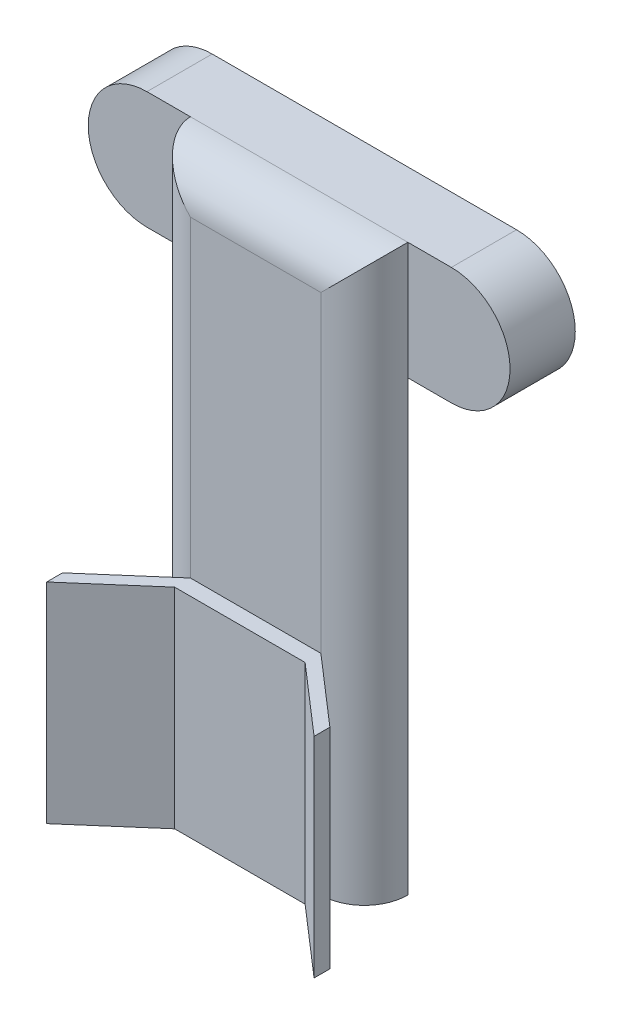
ISO-10303-21;
HEADER;
FILE_DESCRIPTION(('STEP AP214'),'2;1');
FILE_NAME('part.step','',(''),(''),'','','');
FILE_SCHEMA(('AUTOMOTIVE_DESIGN { 1 0 10303 214 1 1 1 1 }'));
ENDSEC;
DATA;
#1=APPLICATION_CONTEXT('core data for automotive mechanical design processes');
#2=APPLICATION_PROTOCOL_DEFINITION('international standard','automotive_design',2000,#1);
#3=PRODUCT_CONTEXT('',#1,'mechanical');
#4=PRODUCT('Part','Part','',(#3));
#5=PRODUCT_RELATED_PRODUCT_CATEGORY('part','',(#4));
#6=PRODUCT_DEFINITION_FORMATION('','',#4);
#7=PRODUCT_DEFINITION_CONTEXT('part definition',#1,'design');
#8=PRODUCT_DEFINITION('design','',#6,#7);
#9=PRODUCT_DEFINITION_SHAPE('','',#8);
#10=(LENGTH_UNIT() NAMED_UNIT(*) SI_UNIT(.MILLI.,.METRE.));
#11=(NAMED_UNIT(*) PLANE_ANGLE_UNIT() SI_UNIT($,.RADIAN.));
#12=(NAMED_UNIT(*) SI_UNIT($,.STERADIAN.) SOLID_ANGLE_UNIT());
#13=UNCERTAINTY_MEASURE_WITH_UNIT(LENGTH_MEASURE(1.E-05),#10,'distance_accuracy_value','');
#14=(GEOMETRIC_REPRESENTATION_CONTEXT(3) GLOBAL_UNCERTAINTY_ASSIGNED_CONTEXT((#13)) GLOBAL_UNIT_ASSIGNED_CONTEXT((#10,
#11,#12)) REPRESENTATION_CONTEXT('',''));
#15=CARTESIAN_POINT('',(0.,0.,0.));
#16=DIRECTION('',(0.,0.,1.));
#17=DIRECTION('',(1.,0.,0.));
#18=AXIS2_PLACEMENT_3D('',#15,#16,#17);
#19=CARTESIAN_POINT('',(15.,133.606993365739,15.));
#20=DIRECTION('',(0.,0.,1.));
#21=DIRECTION('',(1.,0.,0.));
#22=AXIS2_PLACEMENT_3D('',#19,#20,#21);
#23=PLANE('',#22);
#24=DIRECTION('',(0.,-1.,0.));
#25=VECTOR('',#24,1.);
#26=CARTESIAN_POINT('',(-10.,225.565015771818,15.));
#27=LINE('',#26,#25);
#28=CARTESIAN_POINT('',(-10.,225.565015771818,15.));
#29=VERTEX_POINT('',#28);
#30=CARTESIAN_POINT('',(-10.,198.565015771818,15.));
#31=VERTEX_POINT('',#30);
#32=EDGE_CURVE('E210',#29,#31,#27,.T.);
#33=ORIENTED_EDGE('',*,*,#32,.F.);
#34=DIRECTION('',(-1.,0.,0.));
#35=VECTOR('',#34,1.);
#36=CARTESIAN_POINT('',(15.,225.565015771818,15.));
#37=LINE('',#36,#35);
#38=CARTESIAN_POINT('',(-20.,225.565015771818,15.));
#39=VERTEX_POINT('',#38);
#40=EDGE_CURVE('E292',#29,#39,#37,.T.);
#41=ORIENTED_EDGE('',*,*,#40,.T.);
#42=CARTESIAN_POINT('',(-20.,212.065015771818,15.));
#43=DIRECTION('',(0.,0.,1.));
#44=DIRECTION('',(1.,0.,0.));
#45=AXIS2_PLACEMENT_3D('',#42,#43,#44);
#46=CIRCLE('',#45,13.5);
#47=CARTESIAN_POINT('',(-20.,198.565015771818,15.));
#48=VERTEX_POINT('',#47);
#49=EDGE_CURVE('E289',#39,#48,#46,.T.);
#50=ORIENTED_EDGE('',*,*,#49,.T.);
#51=DIRECTION('',(-1.,0.,0.));
#52=VECTOR('',#51,1.);
#53=CARTESIAN_POINT('',(15.,198.565015771818,15.));
#54=LINE('',#53,#52);
#55=EDGE_CURVE('E318',#31,#48,#54,.T.);
#56=ORIENTED_EDGE('',*,*,#55,.F.);
#57=EDGE_LOOP('',(#33,#41,#50,#56));
#58=FACE_BOUND('',#57,.T.);
#59=ADVANCED_FACE('F34',(#58),#23,.T.);
#60=CARTESIAN_POINT('',(15.,225.565015771818,15.));
#61=DIRECTION('',(0.,-1.,0.));
#62=DIRECTION('',(0.,0.,-1.));
#63=AXIS2_PLACEMENT_3D('',#60,#61,#62);
#64=PLANE('',#63);
#65=ORIENTED_EDGE('',*,*,#40,.F.);
#66=DIRECTION('',(-1.,0.,0.));
#67=VECTOR('',#66,1.);
#68=CARTESIAN_POINT('',(40.,225.565015771818,15.));
#69=LINE('',#68,#67);
#70=CARTESIAN_POINT('',(40.,225.565015771818,15.));
#71=VERTEX_POINT('',#70);
#72=EDGE_CURVE('E11',#29,#71,#69,.F.);
#73=ORIENTED_EDGE('',*,*,#72,.T.);
#74=CARTESIAN_POINT('',(50.,225.565015771818,15.));
#75=VERTEX_POINT('',#74);
#76=EDGE_CURVE('E294',#75,#71,#37,.T.);
#77=ORIENTED_EDGE('',*,*,#76,.F.);
#78=DIRECTION('',(0.,0.,-1.));
#79=VECTOR('',#78,1.);
#80=CARTESIAN_POINT('',(50.,225.565015771818,15.));
#81=LINE('',#80,#79);
#82=CARTESIAN_POINT('',(50.,225.565015771818,0.));
#83=VERTEX_POINT('',#82);
#84=EDGE_CURVE('E304',#75,#83,#81,.T.);
#85=ORIENTED_EDGE('',*,*,#84,.T.);
#86=DIRECTION('',(-1.,0.,0.));
#87=VECTOR('',#86,1.);
#88=CARTESIAN_POINT('',(15.,225.565015771818,0.));
#89=LINE('',#88,#87);
#90=CARTESIAN_POINT('',(-20.,225.565015771818,0.));
#91=VERTEX_POINT('',#90);
#92=EDGE_CURVE('E281',#83,#91,#89,.T.);
#93=ORIENTED_EDGE('',*,*,#92,.T.);
#94=DIRECTION('',(0.,0.,-1.));
#95=VECTOR('',#94,1.);
#96=CARTESIAN_POINT('',(-20.,225.565015771818,15.));
#97=LINE('',#96,#95);
#98=EDGE_CURVE('E297',#39,#91,#97,.T.);
#99=ORIENTED_EDGE('',*,*,#98,.F.);
#100=EDGE_LOOP('',(#65,#73,#77,#85,#93,#99));
#101=FACE_BOUND('',#100,.T.);
#102=ADVANCED_FACE('F342',(#101),#64,.F.);
#103=CARTESIAN_POINT('',(-20.,212.065015771818,15.));
#104=DIRECTION('',(0.,0.,-1.));
#105=DIRECTION('',(-1.,0.,0.));
#106=AXIS2_PLACEMENT_3D('',#103,#104,#105);
#107=CYLINDRICAL_SURFACE('',#106,13.5);
#108=CARTESIAN_POINT('',(-20.,212.065015771818,0.));
#109=DIRECTION('',(0.,0.,1.));
#110=DIRECTION('',(1.,0.,0.));
#111=AXIS2_PLACEMENT_3D('',#108,#109,#110);
#112=CIRCLE('',#111,13.5);
#113=CARTESIAN_POINT('',(-20.,198.565015771818,0.));
#114=VERTEX_POINT('',#113);
#115=EDGE_CURVE('E283',#91,#114,#112,.T.);
#116=ORIENTED_EDGE('',*,*,#115,.T.);
#117=DIRECTION('',(0.,0.,-1.));
#118=VECTOR('',#117,1.);
#119=CARTESIAN_POINT('',(-20.,198.565015771818,15.));
#120=LINE('',#119,#118);
#121=EDGE_CURVE('E300',#48,#114,#120,.T.);
#122=ORIENTED_EDGE('',*,*,#121,.F.);
#123=ORIENTED_EDGE('',*,*,#49,.F.);
#124=ORIENTED_EDGE('',*,*,#98,.T.);
#125=EDGE_LOOP('',(#116,#122,#123,#124));
#126=FACE_BOUND('',#125,.T.);
#127=ADVANCED_FACE('F329',(#126),#107,.T.);
#128=CARTESIAN_POINT('',(15.,198.565015771818,15.));
#129=DIRECTION('',(0.,-1.,0.));
#130=DIRECTION('',(0.,0.,-1.));
#131=AXIS2_PLACEMENT_3D('',#128,#129,#130);
#132=PLANE('',#131);
#133=DIRECTION('',(-1.,0.,0.));
#134=VECTOR('',#133,1.);
#135=CARTESIAN_POINT('',(15.,198.565015771818,0.));
#136=LINE('',#135,#134);
#137=CARTESIAN_POINT('',(50.,198.565015771818,0.));
#138=VERTEX_POINT('',#137);
#139=EDGE_CURVE('E310',#138,#114,#136,.T.);
#140=ORIENTED_EDGE('',*,*,#139,.F.);
#141=DIRECTION('',(0.,0.,-1.));
#142=VECTOR('',#141,1.);
#143=CARTESIAN_POINT('',(50.,198.565015771818,15.));
#144=LINE('',#143,#142);
#145=CARTESIAN_POINT('',(50.,198.565015771818,15.));
#146=VERTEX_POINT('',#145);
#147=EDGE_CURVE('E302',#146,#138,#144,.T.);
#148=ORIENTED_EDGE('',*,*,#147,.F.);
#149=CARTESIAN_POINT('',(40.,198.565015771818,15.));
#150=VERTEX_POINT('',#149);
#151=EDGE_CURVE('E315',#146,#150,#54,.T.);
#152=ORIENTED_EDGE('',*,*,#151,.T.);
#153=EDGE_CURVE('E317',#150,#31,#54,.T.);
#154=ORIENTED_EDGE('',*,*,#153,.T.);
#155=ORIENTED_EDGE('',*,*,#55,.T.);
#156=ORIENTED_EDGE('',*,*,#121,.T.);
#157=EDGE_LOOP('',(#140,#148,#152,#154,#155,#156));
#158=FACE_BOUND('',#157,.T.);
#159=ADVANCED_FACE('F331',(#158),#132,.T.);
#160=CARTESIAN_POINT('',(50.,212.065015771818,15.));
#161=DIRECTION('',(0.,0.,-1.));
#162=DIRECTION('',(-1.,0.,0.));
#163=AXIS2_PLACEMENT_3D('',#160,#161,#162);
#164=CYLINDRICAL_SURFACE('',#163,13.5);
#165=CARTESIAN_POINT('',(50.,212.065015771818,0.));
#166=DIRECTION('',(0.,0.,1.));
#167=DIRECTION('',(1.,0.,0.));
#168=AXIS2_PLACEMENT_3D('',#165,#166,#167);
#169=CIRCLE('',#168,13.5);
#170=EDGE_CURVE('E308',#138,#83,#169,.T.);
#171=ORIENTED_EDGE('',*,*,#170,.T.);
#172=ORIENTED_EDGE('',*,*,#84,.F.);
#173=CARTESIAN_POINT('',(50.,212.065015771818,15.));
#174=DIRECTION('',(0.,0.,1.));
#175=DIRECTION('',(1.,0.,0.));
#176=AXIS2_PLACEMENT_3D('',#173,#174,#175);
#177=CIRCLE('',#176,13.5);
#178=EDGE_CURVE('E307',#146,#75,#177,.T.);
#179=ORIENTED_EDGE('',*,*,#178,.F.);
#180=ORIENTED_EDGE('',*,*,#147,.T.);
#181=EDGE_LOOP('',(#171,#172,#179,#180));
#182=FACE_BOUND('',#181,.T.);
#183=ADVANCED_FACE('F339',(#182),#164,.T.);
#184=DIRECTION('',(0.,1.,0.));
#185=VECTOR('',#184,1.);
#186=CARTESIAN_POINT('',(40.,225.565015771818,15.));
#187=LINE('',#186,#185);
#188=EDGE_CURVE('E218',#150,#71,#187,.T.);
#189=ORIENTED_EDGE('',*,*,#188,.F.);
#190=ORIENTED_EDGE('',*,*,#151,.F.);
#191=ORIENTED_EDGE('',*,*,#178,.T.);
#192=ORIENTED_EDGE('',*,*,#76,.T.);
#193=EDGE_LOOP('',(#189,#190,#191,#192));
#194=FACE_BOUND('',#193,.T.);
#195=ADVANCED_FACE('F344',(#194),#23,.T.);
#196=CARTESIAN_POINT('',(15.,133.606993365739,0.));
#197=DIRECTION('',(0.,0.,1.));
#198=DIRECTION('',(1.,0.,0.));
#199=AXIS2_PLACEMENT_3D('',#196,#197,#198);
#200=PLANE('',#199);
#201=ORIENTED_EDGE('',*,*,#92,.F.);
#202=ORIENTED_EDGE('',*,*,#170,.F.);
#203=ORIENTED_EDGE('',*,*,#139,.T.);
#204=ORIENTED_EDGE('',*,*,#115,.F.);
#205=EDGE_LOOP('',(#201,#202,#203,#204));
#206=FACE_BOUND('',#205,.T.);
#207=ADVANCED_FACE('F336',(#206),#200,.F.);
#208=CARTESIAN_POINT('',(-10.,95.5650157718177,25.));
#209=DIRECTION('',(0.,1.,0.));
#210=DIRECTION('',(0.,0.,1.));
#211=AXIS2_PLACEMENT_3D('',#208,#209,#210);
#212=PLANE('',#211);
#213=DIRECTION('',(0.754898050561559,0.,-0.655842155749658));
#214=VECTOR('',#213,1.);
#215=CARTESIAN_POINT('',(31.9181543078593,95.5650157718177,-2.7299313639036));
#216=LINE('',#215,#214);
#217=CARTESIAN_POINT('',(-15.7417727365288,95.5650157718177,38.6761754241732));
#218=VERTEX_POINT('',#217);
#219=CARTESIAN_POINT('',(0.,95.5650157718177,25.));
#220=VERTEX_POINT('',#219);
#221=EDGE_CURVE('E159',#218,#220,#216,.T.);
#222=ORIENTED_EDGE('',*,*,#221,.T.);
#223=CARTESIAN_POINT('',(0.,95.5650157718177,15.));
#224=DIRECTION('',(0.,1.,0.));
#225=DIRECTION('',(0.,0.,1.));
#226=AXIS2_PLACEMENT_3D('',#223,#224,#225);
#227=CIRCLE('',#226,10.);
#228=CARTESIAN_POINT('',(-10.,95.5650157718177,15.));
#229=VERTEX_POINT('',#228);
#230=EDGE_CURVE('E224',#220,#229,#227,.F.);
#231=ORIENTED_EDGE('',*,*,#230,.T.);
#232=DIRECTION('',(1.,0.,0.));
#233=VECTOR('',#232,1.);
#234=CARTESIAN_POINT('',(-10.,95.5650157718177,15.));
#235=LINE('',#234,#233);
#236=CARTESIAN_POINT('',(40.,95.5650157718177,15.));
#237=VERTEX_POINT('',#236);
#238=EDGE_CURVE('E212',#229,#237,#235,.T.);
#239=ORIENTED_EDGE('',*,*,#238,.T.);
#240=CARTESIAN_POINT('',(30.,95.5650157718177,15.));
#241=DIRECTION('',(0.,1.,0.));
#242=DIRECTION('',(0.,0.,1.));
#243=AXIS2_PLACEMENT_3D('',#240,#241,#242);
#244=CIRCLE('',#243,10.);
#245=CARTESIAN_POINT('',(30.,95.5650157718177,25.));
#246=VERTEX_POINT('',#245);
#247=EDGE_CURVE('E43',#237,#246,#244,.F.);
#248=ORIENTED_EDGE('',*,*,#247,.T.);
#249=DIRECTION('',(-0.754898050561559,0.,-0.655842155749658));
#250=VECTOR('',#249,1.);
#251=CARTESIAN_POINT('',(-1.91815430785926,95.5650157718177,-2.7299313639036));
#252=LINE('',#251,#250);
#253=CARTESIAN_POINT('',(45.7417727365288,95.5650157718177,38.6761754241732));
#254=VERTEX_POINT('',#253);
#255=EDGE_CURVE('E203',#254,#246,#252,.T.);
#256=ORIENTED_EDGE('',*,*,#255,.F.);
#257=DIRECTION('',(0.,0.,1.));
#258=VECTOR('',#257,1.);
#259=CARTESIAN_POINT('',(45.7417727365288,95.5650157718177,-22.2033390949212));
#260=LINE('',#259,#258);
#261=CARTESIAN_POINT('',(45.7417727365288,95.5650157718177,42.3080092611636));
#262=VERTEX_POINT('',#261);
#263=EDGE_CURVE('E156',#254,#262,#260,.T.);
#264=ORIENTED_EDGE('',*,*,#263,.T.);
#265=DIRECTION('',(-0.754898050561559,0.,-0.655842155749658));
#266=VECTOR('',#265,1.);
#267=CARTESIAN_POINT('',(-3.71625332189674,95.5650157718177,-0.660254340989451));
#268=LINE('',#267,#266);
#269=CARTESIAN_POINT('',(30.,95.5650157718177,28.6318338369905));
#270=VERTEX_POINT('',#269);
#271=EDGE_CURVE('E267',#262,#270,#268,.T.);
#272=ORIENTED_EDGE('',*,*,#271,.T.);
#273=DIRECTION('',(-1.,0.,0.));
#274=VECTOR('',#273,1.);
#275=CARTESIAN_POINT('',(15.,95.5650157718177,28.6318338369905));
#276=LINE('',#275,#274);
#277=CARTESIAN_POINT('',(0.,95.5650157718177,28.6318338369905));
#278=VERTEX_POINT('',#277);
#279=EDGE_CURVE('E263',#270,#278,#276,.T.);
#280=ORIENTED_EDGE('',*,*,#279,.T.);
#281=DIRECTION('',(0.754898050561559,0.,-0.655842155749658));
#282=VECTOR('',#281,1.);
#283=CARTESIAN_POINT('',(33.7162533218968,95.5650157718177,-0.660254340989441));
#284=LINE('',#283,#282);
#285=CARTESIAN_POINT('',(-15.7417727365288,95.5650157718177,42.3080092611636));
#286=VERTEX_POINT('',#285);
#287=EDGE_CURVE('E271',#286,#278,#284,.T.);
#288=ORIENTED_EDGE('',*,*,#287,.F.);
#289=DIRECTION('',(0.,0.,1.));
#290=VECTOR('',#289,1.);
#291=CARTESIAN_POINT('',(-15.7417727365288,95.5650157718177,-22.2033390949212));
#292=LINE('',#291,#290);
#293=EDGE_CURVE('E471',#218,#286,#292,.T.);
#294=ORIENTED_EDGE('',*,*,#293,.F.);
#295=EDGE_LOOP('',(#222,#231,#239,#248,#256,#264,#272,#280,#288,#294));
#296=FACE_BOUND('',#295,.T.);
#297=ADVANCED_FACE('F274',(#296),#212,.F.);
#298=CARTESIAN_POINT('',(-10.,95.5650157718177,25.));
#299=DIRECTION('',(0.,0.,1.));
#300=DIRECTION('',(1.,0.,0.));
#301=AXIS2_PLACEMENT_3D('',#298,#299,#300);
#302=PLANE('',#301);
#303=DIRECTION('',(-1.,0.,0.));
#304=VECTOR('',#303,1.);
#305=CARTESIAN_POINT('',(0.,143.698809563473,25.));
#306=LINE('',#305,#304);
#307=CARTESIAN_POINT('',(30.,143.698809563473,25.));
#308=VERTEX_POINT('',#307);
#309=CARTESIAN_POINT('',(0.,143.698809563473,25.));
#310=VERTEX_POINT('',#309);
#311=EDGE_CURVE('E202',#308,#310,#306,.T.);
#312=ORIENTED_EDGE('',*,*,#311,.F.);
#313=DIRECTION('',(0.,1.,0.));
#314=VECTOR('',#313,1.);
#315=CARTESIAN_POINT('',(30.,225.565015771818,25.));
#316=LINE('',#315,#314);
#317=CARTESIAN_POINT('',(30.,215.565015771818,25.));
#318=VERTEX_POINT('',#317);
#319=EDGE_CURVE('E56',#308,#318,#316,.T.);
#320=ORIENTED_EDGE('',*,*,#319,.T.);
#321=DIRECTION('',(-1.,0.,0.));
#322=VECTOR('',#321,1.);
#323=CARTESIAN_POINT('',(-10.,215.565015771818,25.));
#324=LINE('',#323,#322);
#325=CARTESIAN_POINT('',(0.,215.565015771818,25.));
#326=VERTEX_POINT('',#325);
#327=EDGE_CURVE('E51',#318,#326,#324,.T.);
#328=ORIENTED_EDGE('',*,*,#327,.T.);
#329=DIRECTION('',(0.,-1.,0.));
#330=VECTOR('',#329,1.);
#331=CARTESIAN_POINT('',(0.,95.5650157718177,25.));
#332=LINE('',#331,#330);
#333=EDGE_CURVE('E221',#326,#310,#332,.T.);
#334=ORIENTED_EDGE('',*,*,#333,.T.);
#335=EDGE_LOOP('',(#312,#320,#328,#334));
#336=FACE_BOUND('',#335,.T.);
#337=ADVANCED_FACE('F242',(#336),#302,.T.);
#338=CARTESIAN_POINT('',(-10.,95.5650157718177,15.));
#339=DIRECTION('',(0.,0.,1.));
#340=DIRECTION('',(1.,0.,0.));
#341=AXIS2_PLACEMENT_3D('',#338,#339,#340);
#342=PLANE('',#341);
#343=ORIENTED_EDGE('',*,*,#153,.F.);
#344=EDGE_CURVE('E278',#237,#150,#187,.T.);
#345=ORIENTED_EDGE('',*,*,#344,.F.);
#346=ORIENTED_EDGE('',*,*,#238,.F.);
#347=EDGE_CURVE('E206',#31,#229,#27,.T.);
#348=ORIENTED_EDGE('',*,*,#347,.F.);
#349=EDGE_LOOP('',(#343,#345,#346,#348));
#350=FACE_BOUND('',#349,.T.);
#351=ADVANCED_FACE('F370',(#350),#342,.F.);
#352=CARTESIAN_POINT('',(0.,95.5650157718177,15.));
#353=DIRECTION('',(0.,1.,0.));
#354=DIRECTION('',(-1.,0.,0.));
#355=AXIS2_PLACEMENT_3D('',#352,#353,#354);
#356=CYLINDRICAL_SURFACE('',#355,10.);
#357=ORIENTED_EDGE('',*,*,#230,.F.);
#358=DIRECTION('',(0.,-1.,0.));
#359=VECTOR('',#358,1.);
#360=CARTESIAN_POINT('',(0.,143.698809563473,25.));
#361=LINE('',#360,#359);
#362=EDGE_CURVE('E199',#310,#220,#361,.T.);
#363=ORIENTED_EDGE('',*,*,#362,.F.);
#364=ORIENTED_EDGE('',*,*,#333,.F.);
#365=CARTESIAN_POINT('',(0.,215.565015771818,15.));
#366=DIRECTION('',(0.707106781186547,0.707106781186548,0.));
#367=DIRECTION('',(0.707106781186548,-0.707106781186547,0.));
#368=AXIS2_PLACEMENT_3D('',#365,#366,#367);
#369=ELLIPSE('',#368,14.142135623731,10.);
#370=EDGE_CURVE('E211',#29,#326,#369,.T.);
#371=ORIENTED_EDGE('',*,*,#370,.F.);
#372=ORIENTED_EDGE('',*,*,#32,.T.);
#373=ORIENTED_EDGE('',*,*,#347,.T.);
#374=EDGE_LOOP('',(#357,#363,#364,#371,#372,#373));
#375=FACE_BOUND('',#374,.T.);
#376=ADVANCED_FACE('F36',(#375),#356,.T.);
#377=CARTESIAN_POINT('',(-10.,215.565015771818,15.));
#378=DIRECTION('',(1.,0.,0.));
#379=DIRECTION('',(0.,0.,-1.));
#380=AXIS2_PLACEMENT_3D('',#377,#378,#379);
#381=CYLINDRICAL_SURFACE('',#380,10.);
#382=ORIENTED_EDGE('',*,*,#370,.T.);
#383=ORIENTED_EDGE('',*,*,#327,.F.);
#384=CARTESIAN_POINT('',(30.,215.565015771818,15.));
#385=DIRECTION('',(0.707106781186547,-0.707106781186547,0.));
#386=DIRECTION('',(0.707106781186547,0.707106781186548,0.));
#387=AXIS2_PLACEMENT_3D('',#384,#385,#386);
#388=ELLIPSE('',#387,14.1421356237309,10.);
#389=EDGE_CURVE('E205',#71,#318,#388,.T.);
#390=ORIENTED_EDGE('',*,*,#389,.F.);
#391=ORIENTED_EDGE('',*,*,#72,.F.);
#392=EDGE_LOOP('',(#382,#383,#390,#391));
#393=FACE_BOUND('',#392,.T.);
#394=ADVANCED_FACE('F239',(#393),#381,.T.);
#395=CARTESIAN_POINT('',(30.,95.5650157718177,15.));
#396=DIRECTION('',(0.,-1.,0.));
#397=DIRECTION('',(1.,0.,0.));
#398=AXIS2_PLACEMENT_3D('',#395,#396,#397);
#399=CYLINDRICAL_SURFACE('',#398,10.);
#400=ORIENTED_EDGE('',*,*,#344,.T.);
#401=ORIENTED_EDGE('',*,*,#188,.T.);
#402=ORIENTED_EDGE('',*,*,#389,.T.);
#403=ORIENTED_EDGE('',*,*,#319,.F.);
#404=EDGE_CURVE('E167',#246,#308,#316,.T.);
#405=ORIENTED_EDGE('',*,*,#404,.F.);
#406=ORIENTED_EDGE('',*,*,#247,.F.);
#407=EDGE_LOOP('',(#400,#401,#402,#403,#405,#406));
#408=FACE_BOUND('',#407,.T.);
#409=ADVANCED_FACE('F236',(#408),#399,.T.);
#410=CARTESIAN_POINT('',(15.,143.698809563473,-22.2033390949212));
#411=DIRECTION('',(0.,-1.,0.));
#412=DIRECTION('',(0.,0.,-1.));
#413=AXIS2_PLACEMENT_3D('',#410,#411,#412);
#414=PLANE('',#413);
#415=ORIENTED_EDGE('',*,*,#311,.T.);
#416=DIRECTION('',(-0.754898050561559,0.,0.655842155749658));
#417=VECTOR('',#416,1.);
#418=CARTESIAN_POINT('',(31.9181543078593,143.698809563473,-2.7299313639036));
#419=LINE('',#418,#417);
#420=CARTESIAN_POINT('',(-15.7417727365288,143.698809563473,38.6761754241732));
#421=VERTEX_POINT('',#420);
#422=EDGE_CURVE('E187',#310,#421,#419,.T.);
#423=ORIENTED_EDGE('',*,*,#422,.T.);
#424=DIRECTION('',(0.,0.,-1.));
#425=VECTOR('',#424,1.);
#426=CARTESIAN_POINT('',(-15.7417727365288,143.698809563473,-22.2033390949212));
#427=LINE('',#426,#425);
#428=CARTESIAN_POINT('',(-15.7417727365288,143.698809563473,42.3080092611636));
#429=VERTEX_POINT('',#428);
#430=EDGE_CURVE('E184',#429,#421,#427,.T.);
#431=ORIENTED_EDGE('',*,*,#430,.F.);
#432=DIRECTION('',(-0.754898050561559,0.,0.655842155749658));
#433=VECTOR('',#432,1.);
#434=CARTESIAN_POINT('',(33.7162533218968,143.698809563473,-0.660254340989441));
#435=LINE('',#434,#433);
#436=CARTESIAN_POINT('',(0.,143.698809563473,28.6318338369905));
#437=VERTEX_POINT('',#436);
#438=EDGE_CURVE('E181',#437,#429,#435,.T.);
#439=ORIENTED_EDGE('',*,*,#438,.F.);
#440=DIRECTION('',(1.,0.,0.));
#441=VECTOR('',#440,1.);
#442=CARTESIAN_POINT('',(15.,143.698809563473,28.6318338369905));
#443=LINE('',#442,#441);
#444=CARTESIAN_POINT('',(30.,143.698809563473,28.6318338369905));
#445=VERTEX_POINT('',#444);
#446=EDGE_CURVE('E176',#437,#445,#443,.T.);
#447=ORIENTED_EDGE('',*,*,#446,.T.);
#448=DIRECTION('',(0.754898050561559,0.,0.655842155749658));
#449=VECTOR('',#448,1.);
#450=CARTESIAN_POINT('',(-3.71625332189674,143.698809563473,-0.660254340989451));
#451=LINE('',#450,#449);
#452=CARTESIAN_POINT('',(45.7417727365288,143.698809563473,42.3080092611636));
#453=VERTEX_POINT('',#452);
#454=EDGE_CURVE('E174',#445,#453,#451,.T.);
#455=ORIENTED_EDGE('',*,*,#454,.T.);
#456=DIRECTION('',(0.,0.,-1.));
#457=VECTOR('',#456,1.);
#458=CARTESIAN_POINT('',(45.7417727365288,143.698809563473,-22.2033390949212));
#459=LINE('',#458,#457);
#460=CARTESIAN_POINT('',(45.7417727365288,143.698809563473,38.6761754241732));
#461=VERTEX_POINT('',#460);
#462=EDGE_CURVE('E154',#453,#461,#459,.T.);
#463=ORIENTED_EDGE('',*,*,#462,.T.);
#464=DIRECTION('',(0.754898050561559,0.,0.655842155749658));
#465=VECTOR('',#464,1.);
#466=CARTESIAN_POINT('',(-1.91815430785926,143.698809563473,-2.7299313639036));
#467=LINE('',#466,#465);
#468=EDGE_CURVE('E164',#308,#461,#467,.T.);
#469=ORIENTED_EDGE('',*,*,#468,.F.);
#470=EDGE_LOOP('',(#415,#423,#431,#439,#447,#455,#463,#469));
#471=FACE_BOUND('',#470,.T.);
#472=ADVANCED_FACE('F171',(#471),#414,.F.);
#473=CARTESIAN_POINT('',(31.9181543078593,29.0765077670453,-2.7299313639036));
#474=DIRECTION('',(-0.655842155749658,0.,-0.754898050561559));
#475=DIRECTION('',(-0.754898050561559,0.,0.655842155749658));
#476=AXIS2_PLACEMENT_3D('',#473,#474,#475);
#477=PLANE('',#476);
#478=ORIENTED_EDGE('',*,*,#221,.F.);
#479=DIRECTION('',(0.,1.,0.));
#480=VECTOR('',#479,1.);
#481=CARTESIAN_POINT('',(-15.7417727365288,29.0765077670453,38.6761754241732));
#482=LINE('',#481,#480);
#483=EDGE_CURVE('E190',#218,#421,#482,.T.);
#484=ORIENTED_EDGE('',*,*,#483,.T.);
#485=ORIENTED_EDGE('',*,*,#422,.F.);
#486=ORIENTED_EDGE('',*,*,#362,.T.);
#487=EDGE_LOOP('',(#478,#484,#485,#486));
#488=FACE_BOUND('',#487,.T.);
#489=ADVANCED_FACE('F247',(#488),#477,.T.);
#490=CARTESIAN_POINT('',(-15.7417727365288,29.0765077670453,-22.2033390949212));
#491=DIRECTION('',(1.,0.,0.));
#492=DIRECTION('',(0.,0.,-1.));
#493=AXIS2_PLACEMENT_3D('',#490,#491,#492);
#494=PLANE('',#493);
#495=ORIENTED_EDGE('',*,*,#483,.F.);
#496=ORIENTED_EDGE('',*,*,#293,.T.);
#497=DIRECTION('',(0.,1.,0.));
#498=VECTOR('',#497,1.);
#499=CARTESIAN_POINT('',(-15.7417727365288,29.0765077670453,42.3080092611636));
#500=LINE('',#499,#498);
#501=EDGE_CURVE('E192',#286,#429,#500,.T.);
#502=ORIENTED_EDGE('',*,*,#501,.T.);
#503=ORIENTED_EDGE('',*,*,#430,.T.);
#504=EDGE_LOOP('',(#495,#496,#502,#503));
#505=FACE_BOUND('',#504,.T.);
#506=ADVANCED_FACE('F252',(#505),#494,.F.);
#507=CARTESIAN_POINT('',(33.7162533218968,29.0765077670453,-0.660254340989441));
#508=DIRECTION('',(-0.655842155749658,0.,-0.754898050561559));
#509=DIRECTION('',(-0.754898050561559,0.,0.655842155749658));
#510=AXIS2_PLACEMENT_3D('',#507,#508,#509);
#511=PLANE('',#510);
#512=ORIENTED_EDGE('',*,*,#501,.F.);
#513=ORIENTED_EDGE('',*,*,#287,.T.);
#514=DIRECTION('',(0.,1.,0.));
#515=VECTOR('',#514,1.);
#516=CARTESIAN_POINT('',(0.,29.0765077670453,28.6318338369905));
#517=LINE('',#516,#515);
#518=EDGE_CURVE('E194',#278,#437,#517,.T.);
#519=ORIENTED_EDGE('',*,*,#518,.T.);
#520=ORIENTED_EDGE('',*,*,#438,.T.);
#521=EDGE_LOOP('',(#512,#513,#519,#520));
#522=FACE_BOUND('',#521,.T.);
#523=ADVANCED_FACE('F428',(#522),#511,.F.);
#524=CARTESIAN_POINT('',(15.,29.0765077670453,28.6318338369905));
#525=DIRECTION('',(0.,0.,1.));
#526=DIRECTION('',(1.,0.,0.));
#527=AXIS2_PLACEMENT_3D('',#524,#525,#526);
#528=PLANE('',#527);
#529=ORIENTED_EDGE('',*,*,#279,.F.);
#530=DIRECTION('',(0.,1.,0.));
#531=VECTOR('',#530,1.);
#532=CARTESIAN_POINT('',(30.,29.0765077670453,28.6318338369905));
#533=LINE('',#532,#531);
#534=EDGE_CURVE('E196',#270,#445,#533,.T.);
#535=ORIENTED_EDGE('',*,*,#534,.T.);
#536=ORIENTED_EDGE('',*,*,#446,.F.);
#537=ORIENTED_EDGE('',*,*,#518,.F.);
#538=EDGE_LOOP('',(#529,#535,#536,#537));
#539=FACE_BOUND('',#538,.T.);
#540=ADVANCED_FACE('F260',(#539),#528,.T.);
#541=CARTESIAN_POINT('',(-3.71625332189674,29.0765077670453,-0.660254340989451));
#542=DIRECTION('',(-0.655842155749658,0.,0.754898050561559));
#543=DIRECTION('',(0.754898050561559,0.,0.655842155749658));
#544=AXIS2_PLACEMENT_3D('',#541,#542,#543);
#545=PLANE('',#544);
#546=ORIENTED_EDGE('',*,*,#271,.F.);
#547=DIRECTION('',(0.,1.,0.));
#548=VECTOR('',#547,1.);
#549=CARTESIAN_POINT('',(45.7417727365288,29.0765077670453,42.3080092611636));
#550=LINE('',#549,#548);
#551=EDGE_CURVE('E160',#262,#453,#550,.T.);
#552=ORIENTED_EDGE('',*,*,#551,.T.);
#553=ORIENTED_EDGE('',*,*,#454,.F.);
#554=ORIENTED_EDGE('',*,*,#534,.F.);
#555=EDGE_LOOP('',(#546,#552,#553,#554));
#556=FACE_BOUND('',#555,.T.);
#557=ADVANCED_FACE('F266',(#556),#545,.T.);
#558=CARTESIAN_POINT('',(45.7417727365288,29.0765077670453,-22.2033390949212));
#559=DIRECTION('',(1.,0.,0.));
#560=DIRECTION('',(0.,0.,-1.));
#561=AXIS2_PLACEMENT_3D('',#558,#559,#560);
#562=PLANE('',#561);
#563=ORIENTED_EDGE('',*,*,#263,.F.);
#564=DIRECTION('',(0.,1.,0.));
#565=VECTOR('',#564,1.);
#566=CARTESIAN_POINT('',(45.7417727365288,29.0765077670453,38.6761754241732));
#567=LINE('',#566,#565);
#568=EDGE_CURVE('E149',#254,#461,#567,.T.);
#569=ORIENTED_EDGE('',*,*,#568,.T.);
#570=ORIENTED_EDGE('',*,*,#462,.F.);
#571=ORIENTED_EDGE('',*,*,#551,.F.);
#572=EDGE_LOOP('',(#563,#569,#570,#571));
#573=FACE_BOUND('',#572,.T.);
#574=ADVANCED_FACE('F151',(#573),#562,.T.);
#575=CARTESIAN_POINT('',(-1.91815430785926,29.0765077670453,-2.7299313639036));
#576=DIRECTION('',(-0.655842155749658,0.,0.754898050561559));
#577=DIRECTION('',(0.754898050561559,0.,0.655842155749658));
#578=AXIS2_PLACEMENT_3D('',#575,#576,#577);
#579=PLANE('',#578);
#580=ORIENTED_EDGE('',*,*,#568,.F.);
#581=ORIENTED_EDGE('',*,*,#255,.T.);
#582=ORIENTED_EDGE('',*,*,#404,.T.);
#583=ORIENTED_EDGE('',*,*,#468,.T.);
#584=EDGE_LOOP('',(#580,#581,#582,#583));
#585=FACE_BOUND('',#584,.T.);
#586=ADVANCED_FACE('F165',(#585),#579,.F.);
#587=CLOSED_SHELL('',(#59,#102,#127,#159,#183,#195,#207,#297,#337,#351,#376,#394,#409,#472,#489,
#506,#523,#540,#557,#574,#586));
#588=MANIFOLD_SOLID_BREP('B2',#587);
#589=ADVANCED_BREP_SHAPE_REPRESENTATION('',(#18,#588),#14);
#590=SHAPE_DEFINITION_REPRESENTATION(#9,#589);
ENDSEC;
END-ISO-10303-21;
